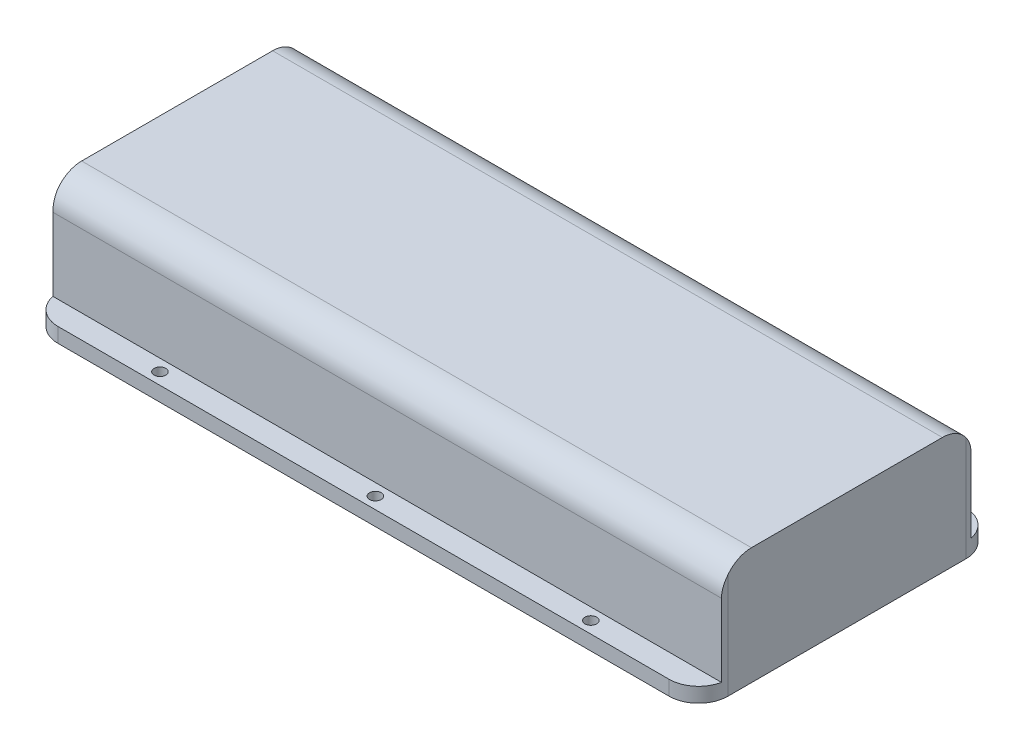
ISO-10303-21;
HEADER;
FILE_DESCRIPTION(('STEP AP214'),'2;1');
FILE_NAME('part.step','',(''),(''),'','','');
FILE_SCHEMA(('AUTOMOTIVE_DESIGN { 1 0 10303 214 1 1 1 1 }'));
ENDSEC;
DATA;
#1=APPLICATION_CONTEXT('core data for automotive mechanical design processes');
#2=APPLICATION_PROTOCOL_DEFINITION('international standard','automotive_design',2000,#1);
#3=PRODUCT_CONTEXT('',#1,'mechanical');
#4=PRODUCT('Part','Part','',(#3));
#5=PRODUCT_RELATED_PRODUCT_CATEGORY('part','',(#4));
#6=PRODUCT_DEFINITION_FORMATION('','',#4);
#7=PRODUCT_DEFINITION_CONTEXT('part definition',#1,'design');
#8=PRODUCT_DEFINITION('design','',#6,#7);
#9=PRODUCT_DEFINITION_SHAPE('','',#8);
#10=(LENGTH_UNIT() NAMED_UNIT(*) SI_UNIT(.MILLI.,.METRE.));
#11=(NAMED_UNIT(*) PLANE_ANGLE_UNIT() SI_UNIT($,.RADIAN.));
#12=(NAMED_UNIT(*) SI_UNIT($,.STERADIAN.) SOLID_ANGLE_UNIT());
#13=UNCERTAINTY_MEASURE_WITH_UNIT(LENGTH_MEASURE(1.E-05),#10,'distance_accuracy_value','');
#14=(GEOMETRIC_REPRESENTATION_CONTEXT(3) GLOBAL_UNCERTAINTY_ASSIGNED_CONTEXT((#13)) GLOBAL_UNIT_ASSIGNED_CONTEXT((#10,
#11,#12)) REPRESENTATION_CONTEXT('',''));
#15=CARTESIAN_POINT('',(0.,0.,0.));
#16=DIRECTION('',(0.,0.,1.));
#17=DIRECTION('',(1.,0.,0.));
#18=AXIS2_PLACEMENT_3D('',#15,#16,#17);
#19=CARTESIAN_POINT('',(0.,5.,0.));
#20=DIRECTION('',(1.,0.,0.));
#21=DIRECTION('',(0.,0.,-1.));
#22=AXIS2_PLACEMENT_3D('',#19,#20,#21);
#23=PLANE('',#22);
#24=DIRECTION('',(0.,0.,1.));
#25=VECTOR('',#24,1.);
#26=CARTESIAN_POINT('',(0.,39.8,-93.));
#27=LINE('',#26,#25);
#28=CARTESIAN_POINT('',(0.,39.8,-83.));
#29=VERTEX_POINT('',#28);
#30=CARTESIAN_POINT('',(0.,39.8,-18.));
#31=VERTEX_POINT('',#30);
#32=EDGE_CURVE('E197',#29,#31,#27,.T.);
#33=ORIENTED_EDGE('',*,*,#32,.F.);
#34=CARTESIAN_POINT('',(0.,29.8,-83.));
#35=DIRECTION('',(1.,0.,0.));
#36=DIRECTION('',(0.,0.,-1.));
#37=AXIS2_PLACEMENT_3D('',#34,#35,#36);
#38=CIRCLE('',#37,10.);
#39=CARTESIAN_POINT('',(0.,35.8000000000006,-91.));
#40=VERTEX_POINT('',#39);
#41=EDGE_CURVE('E323',#29,#40,#38,.F.);
#42=ORIENTED_EDGE('',*,*,#41,.T.);
#43=DIRECTION('',(0.,-1.,0.));
#44=VECTOR('',#43,1.);
#45=CARTESIAN_POINT('',(0.,5.,-91.));
#46=LINE('',#45,#44);
#47=CARTESIAN_POINT('',(0.,0.,-91.));
#48=VERTEX_POINT('',#47);
#49=EDGE_CURVE('E331',#40,#48,#46,.T.);
#50=ORIENTED_EDGE('',*,*,#49,.T.);
#51=DIRECTION('',(0.,0.,1.));
#52=VECTOR('',#51,1.);
#53=CARTESIAN_POINT('',(0.,0.,0.));
#54=LINE('',#53,#52);
#55=CARTESIAN_POINT('',(0.,0.,-10.));
#56=VERTEX_POINT('',#55);
#57=EDGE_CURVE('E637',#48,#56,#54,.T.);
#58=ORIENTED_EDGE('',*,*,#57,.T.);
#59=DIRECTION('',(0.,-1.,0.));
#60=VECTOR('',#59,1.);
#61=CARTESIAN_POINT('',(0.,5.,-10.));
#62=LINE('',#61,#60);
#63=CARTESIAN_POINT('',(0.,35.8000000000006,-10.));
#64=VERTEX_POINT('',#63);
#65=EDGE_CURVE('E287',#56,#64,#62,.F.);
#66=ORIENTED_EDGE('',*,*,#65,.T.);
#67=CARTESIAN_POINT('',(0.,29.8,-18.));
#68=DIRECTION('',(1.,0.,0.));
#69=DIRECTION('',(0.,0.,-1.));
#70=AXIS2_PLACEMENT_3D('',#67,#68,#69);
#71=CIRCLE('',#70,10.);
#72=EDGE_CURVE('E282',#64,#31,#71,.F.);
#73=ORIENTED_EDGE('',*,*,#72,.T.);
#74=EDGE_LOOP('',(#33,#42,#50,#58,#66,#73));
#75=FACE_BOUND('',#74,.T.);
#76=DIRECTION('',(0.,-1.,0.));
#77=VECTOR('',#76,1.);
#78=CARTESIAN_POINT('',(0.,25.4675334604514,-50.3378391953267));
#79=LINE('',#78,#77);
#80=CARTESIAN_POINT('',(0.,25.4675334604514,-50.3378391953267));
#81=VERTEX_POINT('',#80);
#82=CARTESIAN_POINT('',(0.,17.9000292423632,-50.3378391953267));
#83=VERTEX_POINT('',#82);
#84=EDGE_CURVE('E187',#81,#83,#79,.T.);
#85=ORIENTED_EDGE('',*,*,#84,.F.);
#86=DIRECTION('',(0.,0.,-1.));
#87=VECTOR('',#86,1.);
#88=CARTESIAN_POINT('',(0.,25.4675334604514,-50.3378391953267));
#89=LINE('',#88,#87);
#90=CARTESIAN_POINT('',(0.,25.4675334604514,-31.3109714469905));
#91=VERTEX_POINT('',#90);
#92=EDGE_CURVE('E184',#91,#81,#89,.T.);
#93=ORIENTED_EDGE('',*,*,#92,.F.);
#94=DIRECTION('',(0.,1.,0.));
#95=VECTOR('',#94,1.);
#96=CARTESIAN_POINT('',(0.,25.4675334604514,-31.3109714469905));
#97=LINE('',#96,#95);
#98=CARTESIAN_POINT('',(0.,17.9000292423632,-31.3109714469905));
#99=VERTEX_POINT('',#98);
#100=EDGE_CURVE('E348',#99,#91,#97,.T.);
#101=ORIENTED_EDGE('',*,*,#100,.F.);
#102=DIRECTION('',(0.,0.,1.));
#103=VECTOR('',#102,1.);
#104=CARTESIAN_POINT('',(0.,17.9000292423632,-50.3378391953267));
#105=LINE('',#104,#103);
#106=EDGE_CURVE('E346',#83,#99,#105,.T.);
#107=ORIENTED_EDGE('',*,*,#106,.F.);
#108=EDGE_LOOP('',(#85,#93,#101,#107));
#109=FACE_BOUND('',#108,.T.);
#110=ADVANCED_FACE('F32',(#75,#109),#23,.F.);
#111=CARTESIAN_POINT('',(0.,5.,0.));
#112=DIRECTION('',(0.,-1.,0.));
#113=DIRECTION('',(0.,0.,-1.));
#114=AXIS2_PLACEMENT_3D('',#111,#112,#113);
#115=PLANE('',#114);
#116=CARTESIAN_POINT('',(187.34,5.,-97.));
#117=DIRECTION('',(0.,1.,0.));
#118=DIRECTION('',(0.,0.,1.));
#119=AXIS2_PLACEMENT_3D('',#116,#117,#118);
#120=CIRCLE('',#119,2.);
#121=CARTESIAN_POINT('',(187.34,5.,-95.));
#122=VERTEX_POINT('',#121);
#123=EDGE_CURVE('E632',#122,#122,#120,.T.);
#124=ORIENTED_EDGE('',*,*,#123,.F.);
#125=EDGE_LOOP('',(#124));
#126=FACE_BOUND('',#125,.T.);
#127=CARTESIAN_POINT('',(114.,5.,-97.));
#128=DIRECTION('',(0.,1.,0.));
#129=DIRECTION('',(0.,0.,1.));
#130=AXIS2_PLACEMENT_3D('',#127,#128,#129);
#131=CIRCLE('',#130,2.);
#132=CARTESIAN_POINT('',(114.,5.,-95.));
#133=VERTEX_POINT('',#132);
#134=EDGE_CURVE('E621',#133,#133,#131,.T.);
#135=ORIENTED_EDGE('',*,*,#134,.F.);
#136=EDGE_LOOP('',(#135));
#137=FACE_BOUND('',#136,.T.);
#138=CARTESIAN_POINT('',(40.66,5.,-97.));
#139=DIRECTION('',(0.,1.,0.));
#140=DIRECTION('',(0.,0.,1.));
#141=AXIS2_PLACEMENT_3D('',#138,#139,#140);
#142=CIRCLE('',#141,2.);
#143=CARTESIAN_POINT('',(40.66,5.,-95.));
#144=VERTEX_POINT('',#143);
#145=EDGE_CURVE('E616',#144,#144,#142,.T.);
#146=ORIENTED_EDGE('',*,*,#145,.F.);
#147=EDGE_LOOP('',(#146));
#148=FACE_BOUND('',#147,.T.);
#149=DIRECTION('',(-1.,0.,0.));
#150=VECTOR('',#149,1.);
#151=CARTESIAN_POINT('',(0.,5.,-101.));
#152=LINE('',#151,#150);
#153=CARTESIAN_POINT('',(218.,5.,-101.));
#154=VERTEX_POINT('',#153);
#155=CARTESIAN_POINT('',(10.,5.,-101.));
#156=VERTEX_POINT('',#155);
#157=EDGE_CURVE('E326',#154,#156,#152,.T.);
#158=ORIENTED_EDGE('',*,*,#157,.T.);
#159=CARTESIAN_POINT('',(10.,5.,-91.));
#160=DIRECTION('',(0.,-1.,0.));
#161=DIRECTION('',(0.,0.,-1.));
#162=AXIS2_PLACEMENT_3D('',#159,#160,#161);
#163=CIRCLE('',#162,10.);
#164=CARTESIAN_POINT('',(0.202041028867284,5.,-93.));
#165=VERTEX_POINT('',#164);
#166=EDGE_CURVE('E232',#156,#165,#163,.F.);
#167=ORIENTED_EDGE('',*,*,#166,.T.);
#168=DIRECTION('',(-1.,0.,0.));
#169=VECTOR('',#168,1.);
#170=CARTESIAN_POINT('',(0.,5.,-93.));
#171=LINE('',#170,#169);
#172=CARTESIAN_POINT('',(227.797958971133,5.,-93.));
#173=VERTEX_POINT('',#172);
#174=EDGE_CURVE('E191',#173,#165,#171,.T.);
#175=ORIENTED_EDGE('',*,*,#174,.F.);
#176=CARTESIAN_POINT('',(218.,5.,-91.));
#177=DIRECTION('',(0.,-1.,0.));
#178=DIRECTION('',(0.,0.,-1.));
#179=AXIS2_PLACEMENT_3D('',#176,#177,#178);
#180=CIRCLE('',#179,10.);
#181=EDGE_CURVE('E230',#173,#154,#180,.F.);
#182=ORIENTED_EDGE('',*,*,#181,.T.);
#183=EDGE_LOOP('',(#158,#167,#175,#182));
#184=FACE_BOUND('',#183,.T.);
#185=ADVANCED_FACE('F366',(#126,#137,#148,#184),#115,.F.);
#186=CARTESIAN_POINT('',(187.34,5.,-4.));
#187=DIRECTION('',(0.,1.,0.));
#188=DIRECTION('',(0.,0.,1.));
#189=AXIS2_PLACEMENT_3D('',#186,#187,#188);
#190=CIRCLE('',#189,2.);
#191=CARTESIAN_POINT('',(187.34,5.,-2.00000000000001));
#192=VERTEX_POINT('',#191);
#193=EDGE_CURVE('E601',#192,#192,#190,.T.);
#194=ORIENTED_EDGE('',*,*,#193,.F.);
#195=EDGE_LOOP('',(#194));
#196=FACE_BOUND('',#195,.T.);
#197=CARTESIAN_POINT('',(114.,5.,-4.));
#198=DIRECTION('',(0.,1.,0.));
#199=DIRECTION('',(0.,0.,-1.));
#200=AXIS2_PLACEMENT_3D('',#197,#198,#199);
#201=CIRCLE('',#200,2.);
#202=CARTESIAN_POINT('',(114.,5.,-6.));
#203=VERTEX_POINT('',#202);
#204=EDGE_CURVE('E605',#203,#203,#201,.T.);
#205=ORIENTED_EDGE('',*,*,#204,.F.);
#206=EDGE_LOOP('',(#205));
#207=FACE_BOUND('',#206,.T.);
#208=CARTESIAN_POINT('',(40.66,5.,-4.));
#209=DIRECTION('',(0.,1.,0.));
#210=DIRECTION('',(0.,0.,-1.));
#211=AXIS2_PLACEMENT_3D('',#208,#209,#210);
#212=CIRCLE('',#211,1.99999999999997);
#213=CARTESIAN_POINT('',(40.66,5.,-5.99999999999997));
#214=VERTEX_POINT('',#213);
#215=EDGE_CURVE('E203',#214,#214,#212,.T.);
#216=ORIENTED_EDGE('',*,*,#215,.F.);
#217=EDGE_LOOP('',(#216));
#218=FACE_BOUND('',#217,.T.);
#219=DIRECTION('',(1.,0.,0.));
#220=VECTOR('',#219,1.);
#221=CARTESIAN_POINT('',(0.,5.,0.));
#222=LINE('',#221,#220);
#223=CARTESIAN_POINT('',(10.,5.,0.));
#224=VERTEX_POINT('',#223);
#225=CARTESIAN_POINT('',(218.,5.,0.));
#226=VERTEX_POINT('',#225);
#227=EDGE_CURVE('E294',#224,#226,#222,.T.);
#228=ORIENTED_EDGE('',*,*,#227,.T.);
#229=CARTESIAN_POINT('',(218.,5.,-10.));
#230=DIRECTION('',(0.,-1.,0.));
#231=DIRECTION('',(0.,0.,-1.));
#232=AXIS2_PLACEMENT_3D('',#229,#230,#231);
#233=CIRCLE('',#232,10.);
#234=CARTESIAN_POINT('',(227.797958971133,5.,-8.00000000000001));
#235=VERTEX_POINT('',#234);
#236=EDGE_CURVE('E11',#226,#235,#233,.F.);
#237=ORIENTED_EDGE('',*,*,#236,.T.);
#238=DIRECTION('',(1.,0.,0.));
#239=VECTOR('',#238,1.);
#240=CARTESIAN_POINT('',(0.,5.,-8.00000000000001));
#241=LINE('',#240,#239);
#242=CARTESIAN_POINT('',(0.202041028867289,5.,-8.00000000000001));
#243=VERTEX_POINT('',#242);
#244=EDGE_CURVE('E188',#243,#235,#241,.T.);
#245=ORIENTED_EDGE('',*,*,#244,.F.);
#246=CARTESIAN_POINT('',(10.,5.,-10.));
#247=DIRECTION('',(0.,-1.,0.));
#248=DIRECTION('',(0.,0.,-1.));
#249=AXIS2_PLACEMENT_3D('',#246,#247,#248);
#250=CIRCLE('',#249,10.);
#251=EDGE_CURVE('E45',#243,#224,#250,.F.);
#252=ORIENTED_EDGE('',*,*,#251,.T.);
#253=EDGE_LOOP('',(#228,#237,#245,#252));
#254=FACE_BOUND('',#253,.T.);
#255=ADVANCED_FACE('F292',(#196,#207,#218,#254),#115,.F.);
#256=CARTESIAN_POINT('',(0.,5.,0.));
#257=DIRECTION('',(0.,0.,-1.));
#258=DIRECTION('',(-1.,0.,0.));
#259=AXIS2_PLACEMENT_3D('',#256,#257,#258);
#260=PLANE('',#259);
#261=DIRECTION('',(1.,0.,0.));
#262=VECTOR('',#261,1.);
#263=CARTESIAN_POINT('',(0.,0.,0.));
#264=LINE('',#263,#262);
#265=CARTESIAN_POINT('',(10.,0.,0.));
#266=VERTEX_POINT('',#265);
#267=CARTESIAN_POINT('',(218.,0.,0.));
#268=VERTEX_POINT('',#267);
#269=EDGE_CURVE('E646',#266,#268,#264,.T.);
#270=ORIENTED_EDGE('',*,*,#269,.T.);
#271=DIRECTION('',(0.,-1.,0.));
#272=VECTOR('',#271,1.);
#273=CARTESIAN_POINT('',(218.,5.,0.));
#274=LINE('',#273,#272);
#275=EDGE_CURVE('E53',#268,#226,#274,.F.);
#276=ORIENTED_EDGE('',*,*,#275,.T.);
#277=ORIENTED_EDGE('',*,*,#227,.F.);
#278=DIRECTION('',(0.,-1.,0.));
#279=VECTOR('',#278,1.);
#280=CARTESIAN_POINT('',(10.,5.,0.));
#281=LINE('',#280,#279);
#282=EDGE_CURVE('E234',#224,#266,#281,.T.);
#283=ORIENTED_EDGE('',*,*,#282,.T.);
#284=EDGE_LOOP('',(#270,#276,#277,#283));
#285=FACE_BOUND('',#284,.T.);
#286=ADVANCED_FACE('F374',(#285),#260,.F.);
#287=CARTESIAN_POINT('',(228.,5.,0.));
#288=DIRECTION('',(-1.,0.,0.));
#289=DIRECTION('',(0.,0.,1.));
#290=AXIS2_PLACEMENT_3D('',#287,#288,#289);
#291=PLANE('',#290);
#292=DIRECTION('',(0.,-1.,0.));
#293=VECTOR('',#292,1.);
#294=CARTESIAN_POINT('',(228.,5.,-91.));
#295=LINE('',#294,#293);
#296=CARTESIAN_POINT('',(228.,0.,-91.));
#297=VERTEX_POINT('',#296);
#298=CARTESIAN_POINT('',(228.,35.8000000000006,-91.));
#299=VERTEX_POINT('',#298);
#300=EDGE_CURVE('E304',#297,#299,#295,.F.);
#301=ORIENTED_EDGE('',*,*,#300,.T.);
#302=CARTESIAN_POINT('',(228.,29.8,-83.));
#303=DIRECTION('',(-1.,0.,0.));
#304=DIRECTION('',(0.,0.,1.));
#305=AXIS2_PLACEMENT_3D('',#302,#303,#304);
#306=CIRCLE('',#305,10.);
#307=CARTESIAN_POINT('',(228.,39.8,-83.));
#308=VERTEX_POINT('',#307);
#309=EDGE_CURVE('E210',#299,#308,#306,.F.);
#310=ORIENTED_EDGE('',*,*,#309,.T.);
#311=DIRECTION('',(0.,0.,-1.));
#312=VECTOR('',#311,1.);
#313=CARTESIAN_POINT('',(228.,39.8,-93.));
#314=LINE('',#313,#312);
#315=CARTESIAN_POINT('',(228.,39.8,-18.));
#316=VERTEX_POINT('',#315);
#317=EDGE_CURVE('E200',#316,#308,#314,.T.);
#318=ORIENTED_EDGE('',*,*,#317,.F.);
#319=CARTESIAN_POINT('',(228.,29.8,-18.));
#320=DIRECTION('',(-1.,0.,0.));
#321=DIRECTION('',(0.,0.,1.));
#322=AXIS2_PLACEMENT_3D('',#319,#320,#321);
#323=CIRCLE('',#322,10.);
#324=CARTESIAN_POINT('',(228.,35.8000000000006,-10.));
#325=VERTEX_POINT('',#324);
#326=EDGE_CURVE('E301',#316,#325,#323,.F.);
#327=ORIENTED_EDGE('',*,*,#326,.T.);
#328=DIRECTION('',(0.,-1.,0.));
#329=VECTOR('',#328,1.);
#330=CARTESIAN_POINT('',(228.,5.,-10.));
#331=LINE('',#330,#329);
#332=CARTESIAN_POINT('',(228.,0.,-10.));
#333=VERTEX_POINT('',#332);
#334=EDGE_CURVE('E297',#325,#333,#331,.T.);
#335=ORIENTED_EDGE('',*,*,#334,.T.);
#336=DIRECTION('',(0.,0.,-1.));
#337=VECTOR('',#336,1.);
#338=CARTESIAN_POINT('',(228.,0.,0.));
#339=LINE('',#338,#337);
#340=EDGE_CURVE('E648',#333,#297,#339,.T.);
#341=ORIENTED_EDGE('',*,*,#340,.T.);
#342=EDGE_LOOP('',(#301,#310,#318,#327,#335,#341));
#343=FACE_BOUND('',#342,.T.);
#344=ADVANCED_FACE('F313',(#343),#291,.F.);
#345=CARTESIAN_POINT('',(0.,5.,-101.));
#346=DIRECTION('',(0.,0.,1.));
#347=DIRECTION('',(1.,0.,0.));
#348=AXIS2_PLACEMENT_3D('',#345,#346,#347);
#349=PLANE('',#348);
#350=DIRECTION('',(-1.,0.,0.));
#351=VECTOR('',#350,1.);
#352=CARTESIAN_POINT('',(0.,0.,-101.));
#353=LINE('',#352,#351);
#354=CARTESIAN_POINT('',(218.,0.,-101.));
#355=VERTEX_POINT('',#354);
#356=CARTESIAN_POINT('',(10.,0.,-101.));
#357=VERTEX_POINT('',#356);
#358=EDGE_CURVE('E641',#355,#357,#353,.T.);
#359=ORIENTED_EDGE('',*,*,#358,.T.);
#360=DIRECTION('',(0.,-1.,0.));
#361=VECTOR('',#360,1.);
#362=CARTESIAN_POINT('',(10.,5.,-101.));
#363=LINE('',#362,#361);
#364=EDGE_CURVE('E228',#357,#156,#363,.F.);
#365=ORIENTED_EDGE('',*,*,#364,.T.);
#366=ORIENTED_EDGE('',*,*,#157,.F.);
#367=DIRECTION('',(0.,-1.,0.));
#368=VECTOR('',#367,1.);
#369=CARTESIAN_POINT('',(218.,5.,-101.));
#370=LINE('',#369,#368);
#371=EDGE_CURVE('E226',#154,#355,#370,.T.);
#372=ORIENTED_EDGE('',*,*,#371,.T.);
#373=EDGE_LOOP('',(#359,#365,#366,#372));
#374=FACE_BOUND('',#373,.T.);
#375=ADVANCED_FACE('F379',(#374),#349,.F.);
#376=CARTESIAN_POINT('',(0.,0.,0.));
#377=DIRECTION('',(0.,-1.,0.));
#378=DIRECTION('',(0.,0.,-1.));
#379=AXIS2_PLACEMENT_3D('',#376,#377,#378);
#380=PLANE('',#379);
#381=CARTESIAN_POINT('',(40.66,0.,-4.));
#382=DIRECTION('',(0.,1.,0.));
#383=DIRECTION('',(0.,0.,-1.));
#384=AXIS2_PLACEMENT_3D('',#381,#382,#383);
#385=CIRCLE('',#384,1.99999999999997);
#386=CARTESIAN_POINT('',(40.66,0.,-5.99999999999997));
#387=VERTEX_POINT('',#386);
#388=EDGE_CURVE('E609',#387,#387,#385,.T.);
#389=ORIENTED_EDGE('',*,*,#388,.T.);
#390=EDGE_LOOP('',(#389));
#391=FACE_BOUND('',#390,.T.);
#392=CARTESIAN_POINT('',(114.,0.,-4.));
#393=DIRECTION('',(0.,1.,0.));
#394=DIRECTION('',(0.,0.,-1.));
#395=AXIS2_PLACEMENT_3D('',#392,#393,#394);
#396=CIRCLE('',#395,2.);
#397=CARTESIAN_POINT('',(114.,0.,-6.));
#398=VERTEX_POINT('',#397);
#399=EDGE_CURVE('E613',#398,#398,#396,.T.);
#400=ORIENTED_EDGE('',*,*,#399,.T.);
#401=EDGE_LOOP('',(#400));
#402=FACE_BOUND('',#401,.T.);
#403=CARTESIAN_POINT('',(40.66,0.,-97.));
#404=DIRECTION('',(0.,1.,0.));
#405=DIRECTION('',(0.,0.,1.));
#406=AXIS2_PLACEMENT_3D('',#403,#404,#405);
#407=CIRCLE('',#406,2.);
#408=CARTESIAN_POINT('',(40.66,0.,-95.));
#409=VERTEX_POINT('',#408);
#410=EDGE_CURVE('E618',#409,#409,#407,.T.);
#411=ORIENTED_EDGE('',*,*,#410,.T.);
#412=EDGE_LOOP('',(#411));
#413=FACE_BOUND('',#412,.T.);
#414=CARTESIAN_POINT('',(114.,0.,-97.));
#415=DIRECTION('',(0.,1.,0.));
#416=DIRECTION('',(0.,0.,1.));
#417=AXIS2_PLACEMENT_3D('',#414,#415,#416);
#418=CIRCLE('',#417,2.);
#419=CARTESIAN_POINT('',(114.,0.,-95.));
#420=VERTEX_POINT('',#419);
#421=EDGE_CURVE('E624',#420,#420,#418,.T.);
#422=ORIENTED_EDGE('',*,*,#421,.T.);
#423=EDGE_LOOP('',(#422));
#424=FACE_BOUND('',#423,.T.);
#425=CARTESIAN_POINT('',(187.34,0.,-4.));
#426=DIRECTION('',(0.,1.,0.));
#427=DIRECTION('',(0.,0.,1.));
#428=AXIS2_PLACEMENT_3D('',#425,#426,#427);
#429=CIRCLE('',#428,2.);
#430=CARTESIAN_POINT('',(187.34,0.,-2.00000000000001));
#431=VERTEX_POINT('',#430);
#432=EDGE_CURVE('E629',#431,#431,#429,.T.);
#433=ORIENTED_EDGE('',*,*,#432,.T.);
#434=EDGE_LOOP('',(#433));
#435=FACE_BOUND('',#434,.T.);
#436=CARTESIAN_POINT('',(187.34,0.,-97.));
#437=DIRECTION('',(0.,1.,0.));
#438=DIRECTION('',(0.,0.,1.));
#439=AXIS2_PLACEMENT_3D('',#436,#437,#438);
#440=CIRCLE('',#439,2.);
#441=CARTESIAN_POINT('',(187.34,0.,-95.));
#442=VERTEX_POINT('',#441);
#443=EDGE_CURVE('E634',#442,#442,#440,.T.);
#444=ORIENTED_EDGE('',*,*,#443,.T.);
#445=EDGE_LOOP('',(#444));
#446=FACE_BOUND('',#445,.T.);
#447=ORIENTED_EDGE('',*,*,#57,.F.);
#448=CARTESIAN_POINT('',(10.,0.,-91.));
#449=DIRECTION('',(0.,-1.,0.));
#450=DIRECTION('',(0.,0.,-1.));
#451=AXIS2_PLACEMENT_3D('',#448,#449,#450);
#452=CIRCLE('',#451,10.);
#453=EDGE_CURVE('E224',#48,#357,#452,.T.);
#454=ORIENTED_EDGE('',*,*,#453,.T.);
#455=ORIENTED_EDGE('',*,*,#358,.F.);
#456=CARTESIAN_POINT('',(218.,0.,-91.));
#457=DIRECTION('',(0.,-1.,0.));
#458=DIRECTION('',(0.,0.,-1.));
#459=AXIS2_PLACEMENT_3D('',#456,#457,#458);
#460=CIRCLE('',#459,10.);
#461=EDGE_CURVE('E222',#355,#297,#460,.T.);
#462=ORIENTED_EDGE('',*,*,#461,.T.);
#463=ORIENTED_EDGE('',*,*,#340,.F.);
#464=CARTESIAN_POINT('',(218.,0.,-10.));
#465=DIRECTION('',(0.,-1.,0.));
#466=DIRECTION('',(0.,0.,-1.));
#467=AXIS2_PLACEMENT_3D('',#464,#465,#466);
#468=CIRCLE('',#467,10.);
#469=EDGE_CURVE('E220',#333,#268,#468,.T.);
#470=ORIENTED_EDGE('',*,*,#469,.T.);
#471=ORIENTED_EDGE('',*,*,#269,.F.);
#472=CARTESIAN_POINT('',(10.,0.,-10.));
#473=DIRECTION('',(0.,-1.,0.));
#474=DIRECTION('',(0.,0.,-1.));
#475=AXIS2_PLACEMENT_3D('',#472,#473,#474);
#476=CIRCLE('',#475,10.);
#477=EDGE_CURVE('E218',#266,#56,#476,.T.);
#478=ORIENTED_EDGE('',*,*,#477,.T.);
#479=EDGE_LOOP('',(#447,#454,#455,#462,#463,#470,#471,#478));
#480=FACE_BOUND('',#479,.T.);
#481=ADVANCED_FACE('F382',(#391,#402,#413,#424,#435,#446,#480),#380,.T.);
#482=CARTESIAN_POINT('',(187.34,0.,-97.));
#483=DIRECTION('',(0.,1.,0.));
#484=DIRECTION('',(0.,0.,1.));
#485=AXIS2_PLACEMENT_3D('',#482,#483,#484);
#486=CYLINDRICAL_SURFACE('',#485,2.);
#487=ORIENTED_EDGE('',*,*,#443,.F.);
#488=EDGE_LOOP('',(#487));
#489=FACE_BOUND('',#488,.T.);
#490=ORIENTED_EDGE('',*,*,#123,.T.);
#491=EDGE_LOOP('',(#490));
#492=FACE_BOUND('',#491,.T.);
#493=ADVANCED_FACE('F385',(#489,#492),#486,.F.);
#494=CARTESIAN_POINT('',(187.34,0.,-4.));
#495=DIRECTION('',(0.,1.,0.));
#496=DIRECTION('',(0.,0.,1.));
#497=AXIS2_PLACEMENT_3D('',#494,#495,#496);
#498=CYLINDRICAL_SURFACE('',#497,2.);
#499=ORIENTED_EDGE('',*,*,#432,.F.);
#500=EDGE_LOOP('',(#499));
#501=FACE_BOUND('',#500,.T.);
#502=ORIENTED_EDGE('',*,*,#193,.T.);
#503=EDGE_LOOP('',(#502));
#504=FACE_BOUND('',#503,.T.);
#505=ADVANCED_FACE('F390',(#501,#504),#498,.F.);
#506=CARTESIAN_POINT('',(114.,0.,-97.));
#507=DIRECTION('',(0.,1.,0.));
#508=DIRECTION('',(0.,0.,1.));
#509=AXIS2_PLACEMENT_3D('',#506,#507,#508);
#510=CYLINDRICAL_SURFACE('',#509,2.);
#511=ORIENTED_EDGE('',*,*,#421,.F.);
#512=EDGE_LOOP('',(#511));
#513=FACE_BOUND('',#512,.T.);
#514=ORIENTED_EDGE('',*,*,#134,.T.);
#515=EDGE_LOOP('',(#514));
#516=FACE_BOUND('',#515,.T.);
#517=ADVANCED_FACE('F394',(#513,#516),#510,.F.);
#518=CARTESIAN_POINT('',(40.66,0.,-97.));
#519=DIRECTION('',(0.,1.,0.));
#520=DIRECTION('',(0.,0.,1.));
#521=AXIS2_PLACEMENT_3D('',#518,#519,#520);
#522=CYLINDRICAL_SURFACE('',#521,2.);
#523=ORIENTED_EDGE('',*,*,#410,.F.);
#524=EDGE_LOOP('',(#523));
#525=FACE_BOUND('',#524,.T.);
#526=ORIENTED_EDGE('',*,*,#145,.T.);
#527=EDGE_LOOP('',(#526));
#528=FACE_BOUND('',#527,.T.);
#529=ADVANCED_FACE('F398',(#525,#528),#522,.F.);
#530=CARTESIAN_POINT('',(114.,0.,-4.));
#531=DIRECTION('',(0.,1.,0.));
#532=DIRECTION('',(0.,0.,1.));
#533=AXIS2_PLACEMENT_3D('',#530,#531,#532);
#534=CYLINDRICAL_SURFACE('',#533,2.);
#535=ORIENTED_EDGE('',*,*,#399,.F.);
#536=EDGE_LOOP('',(#535));
#537=FACE_BOUND('',#536,.T.);
#538=ORIENTED_EDGE('',*,*,#204,.T.);
#539=EDGE_LOOP('',(#538));
#540=FACE_BOUND('',#539,.T.);
#541=ADVANCED_FACE('F402',(#537,#540),#534,.F.);
#542=CARTESIAN_POINT('',(40.66,0.,-4.));
#543=DIRECTION('',(0.,1.,0.));
#544=DIRECTION('',(0.,0.,1.));
#545=AXIS2_PLACEMENT_3D('',#542,#543,#544);
#546=CYLINDRICAL_SURFACE('',#545,1.99999999999997);
#547=ORIENTED_EDGE('',*,*,#388,.F.);
#548=EDGE_LOOP('',(#547));
#549=FACE_BOUND('',#548,.T.);
#550=ORIENTED_EDGE('',*,*,#215,.T.);
#551=EDGE_LOOP('',(#550));
#552=FACE_BOUND('',#551,.T.);
#553=ADVANCED_FACE('F406',(#549,#552),#546,.F.);
#554=CARTESIAN_POINT('',(0.,39.8,-8.00000000000001));
#555=DIRECTION('',(0.,0.,-1.));
#556=DIRECTION('',(-1.,0.,0.));
#557=AXIS2_PLACEMENT_3D('',#554,#555,#556);
#558=PLANE('',#557);
#559=ORIENTED_EDGE('',*,*,#244,.T.);
#560=DIRECTION('',(0.,-1.,0.));
#561=VECTOR('',#560,1.);
#562=CARTESIAN_POINT('',(227.797958971133,5.,-8.00000000000001));
#563=LINE('',#562,#561);
#564=CARTESIAN_POINT('',(227.797958971133,29.8,-8.00000000000001));
#565=VERTEX_POINT('',#564);
#566=EDGE_CURVE('E216',#235,#565,#563,.F.);
#567=ORIENTED_EDGE('',*,*,#566,.T.);
#568=DIRECTION('',(1.,0.,0.));
#569=VECTOR('',#568,1.);
#570=CARTESIAN_POINT('',(0.,29.8,-8.00000000000001));
#571=LINE('',#570,#569);
#572=CARTESIAN_POINT('',(0.202041028867285,29.8,-8.00000000000001));
#573=VERTEX_POINT('',#572);
#574=EDGE_CURVE('E214',#565,#573,#571,.F.);
#575=ORIENTED_EDGE('',*,*,#574,.T.);
#576=DIRECTION('',(0.,-1.,0.));
#577=VECTOR('',#576,1.);
#578=CARTESIAN_POINT('',(0.202041028867285,39.8,-8.00000000000001));
#579=LINE('',#578,#577);
#580=EDGE_CURVE('E212',#573,#243,#579,.T.);
#581=ORIENTED_EDGE('',*,*,#580,.T.);
#582=EDGE_LOOP('',(#559,#567,#575,#581));
#583=FACE_BOUND('',#582,.T.);
#584=ADVANCED_FACE('F290',(#583),#558,.F.);
#585=CARTESIAN_POINT('',(0.,39.8,-93.));
#586=DIRECTION('',(0.,0.,1.));
#587=DIRECTION('',(1.,0.,0.));
#588=AXIS2_PLACEMENT_3D('',#585,#586,#587);
#589=PLANE('',#588);
#590=ORIENTED_EDGE('',*,*,#174,.T.);
#591=DIRECTION('',(0.,-1.,0.));
#592=VECTOR('',#591,1.);
#593=CARTESIAN_POINT('',(0.202041028867284,5.,-93.));
#594=LINE('',#593,#592);
#595=CARTESIAN_POINT('',(0.202041028867284,29.8,-93.));
#596=VERTEX_POINT('',#595);
#597=EDGE_CURVE('E302',#165,#596,#594,.F.);
#598=ORIENTED_EDGE('',*,*,#597,.T.);
#599=DIRECTION('',(-1.,0.,0.));
#600=VECTOR('',#599,1.);
#601=CARTESIAN_POINT('',(228.,29.8,-93.));
#602=LINE('',#601,#600);
#603=CARTESIAN_POINT('',(227.797958971133,29.8,-93.));
#604=VERTEX_POINT('',#603);
#605=EDGE_CURVE('E306',#596,#604,#602,.F.);
#606=ORIENTED_EDGE('',*,*,#605,.T.);
#607=DIRECTION('',(0.,-1.,0.));
#608=VECTOR('',#607,1.);
#609=CARTESIAN_POINT('',(227.797958971133,39.8,-93.));
#610=LINE('',#609,#608);
#611=EDGE_CURVE('E334',#604,#173,#610,.T.);
#612=ORIENTED_EDGE('',*,*,#611,.T.);
#613=EDGE_LOOP('',(#590,#598,#606,#612));
#614=FACE_BOUND('',#613,.T.);
#615=ADVANCED_FACE('F340',(#614),#589,.F.);
#616=CARTESIAN_POINT('',(0.,39.8,0.));
#617=DIRECTION('',(0.,1.,0.));
#618=DIRECTION('',(0.,0.,1.));
#619=AXIS2_PLACEMENT_3D('',#616,#617,#618);
#620=PLANE('',#619);
#621=ORIENTED_EDGE('',*,*,#317,.T.);
#622=DIRECTION('',(-1.,0.,0.));
#623=VECTOR('',#622,1.);
#624=CARTESIAN_POINT('',(0.,39.8,-83.));
#625=LINE('',#624,#623);
#626=EDGE_CURVE('E320',#308,#29,#625,.T.);
#627=ORIENTED_EDGE('',*,*,#626,.T.);
#628=ORIENTED_EDGE('',*,*,#32,.T.);
#629=DIRECTION('',(1.,0.,0.));
#630=VECTOR('',#629,1.);
#631=CARTESIAN_POINT('',(228.,39.8,-18.));
#632=LINE('',#631,#630);
#633=EDGE_CURVE('E322',#31,#316,#632,.T.);
#634=ORIENTED_EDGE('',*,*,#633,.T.);
#635=EDGE_LOOP('',(#621,#627,#628,#634));
#636=FACE_BOUND('',#635,.T.);
#637=ADVANCED_FACE('F319',(#636),#620,.T.);
#638=CARTESIAN_POINT('',(-2.2,25.4675334604514,-50.3378391953267));
#639=DIRECTION('',(0.,0.,1.));
#640=DIRECTION('',(1.,0.,0.));
#641=AXIS2_PLACEMENT_3D('',#638,#639,#640);
#642=PLANE('',#641);
#643=ORIENTED_EDGE('',*,*,#84,.T.);
#644=DIRECTION('',(1.,0.,0.));
#645=VECTOR('',#644,1.);
#646=CARTESIAN_POINT('',(-2.2,17.9000292423632,-50.3378391953267));
#647=LINE('',#646,#645);
#648=CARTESIAN_POINT('',(-2.2,17.9000292423632,-50.3378391953267));
#649=VERTEX_POINT('',#648);
#650=EDGE_CURVE('E168',#649,#83,#647,.T.);
#651=ORIENTED_EDGE('',*,*,#650,.F.);
#652=DIRECTION('',(0.,-1.,0.));
#653=VECTOR('',#652,1.);
#654=CARTESIAN_POINT('',(-2.2,25.4675334604514,-50.3378391953267));
#655=LINE('',#654,#653);
#656=CARTESIAN_POINT('',(-2.2,25.4675334604514,-50.3378391953267));
#657=VERTEX_POINT('',#656);
#658=EDGE_CURVE('E175',#657,#649,#655,.T.);
#659=ORIENTED_EDGE('',*,*,#658,.F.);
#660=DIRECTION('',(1.,0.,0.));
#661=VECTOR('',#660,1.);
#662=CARTESIAN_POINT('',(-2.2,25.4675334604514,-50.3378391953267));
#663=LINE('',#662,#661);
#664=EDGE_CURVE('E357',#657,#81,#663,.T.);
#665=ORIENTED_EDGE('',*,*,#664,.T.);
#666=EDGE_LOOP('',(#643,#651,#659,#665));
#667=FACE_BOUND('',#666,.T.);
#668=ADVANCED_FACE('F186',(#667),#642,.F.);
#669=CARTESIAN_POINT('',(-2.2,17.9000292423632,-50.3378391953267));
#670=DIRECTION('',(0.,1.,0.));
#671=DIRECTION('',(0.,0.,1.));
#672=AXIS2_PLACEMENT_3D('',#669,#670,#671);
#673=PLANE('',#672);
#674=ORIENTED_EDGE('',*,*,#106,.T.);
#675=DIRECTION('',(1.,0.,0.));
#676=VECTOR('',#675,1.);
#677=CARTESIAN_POINT('',(-2.2,17.9000292423632,-31.3109714469905));
#678=LINE('',#677,#676);
#679=CARTESIAN_POINT('',(-2.2,17.9000292423632,-31.3109714469905));
#680=VERTEX_POINT('',#679);
#681=EDGE_CURVE('E171',#680,#99,#678,.T.);
#682=ORIENTED_EDGE('',*,*,#681,.F.);
#683=DIRECTION('',(0.,0.,1.));
#684=VECTOR('',#683,1.);
#685=CARTESIAN_POINT('',(-2.2,17.9000292423632,-50.3378391953267));
#686=LINE('',#685,#684);
#687=EDGE_CURVE('E163',#649,#680,#686,.T.);
#688=ORIENTED_EDGE('',*,*,#687,.F.);
#689=ORIENTED_EDGE('',*,*,#650,.T.);
#690=EDGE_LOOP('',(#674,#682,#688,#689));
#691=FACE_BOUND('',#690,.T.);
#692=ADVANCED_FACE('F166',(#691),#673,.F.);
#693=CARTESIAN_POINT('',(-2.2,25.4675334604514,-31.3109714469905));
#694=DIRECTION('',(0.,0.,-1.));
#695=DIRECTION('',(-1.,0.,0.));
#696=AXIS2_PLACEMENT_3D('',#693,#694,#695);
#697=PLANE('',#696);
#698=ORIENTED_EDGE('',*,*,#100,.T.);
#699=DIRECTION('',(1.,0.,0.));
#700=VECTOR('',#699,1.);
#701=CARTESIAN_POINT('',(-2.2,25.4675334604514,-31.3109714469905));
#702=LINE('',#701,#700);
#703=CARTESIAN_POINT('',(-2.2,25.4675334604514,-31.3109714469905));
#704=VERTEX_POINT('',#703);
#705=EDGE_CURVE('E193',#704,#91,#702,.T.);
#706=ORIENTED_EDGE('',*,*,#705,.F.);
#707=DIRECTION('',(0.,1.,0.));
#708=VECTOR('',#707,1.);
#709=CARTESIAN_POINT('',(-2.2,25.4675334604514,-31.3109714469905));
#710=LINE('',#709,#708);
#711=EDGE_CURVE('E174',#680,#704,#710,.T.);
#712=ORIENTED_EDGE('',*,*,#711,.F.);
#713=ORIENTED_EDGE('',*,*,#681,.T.);
#714=EDGE_LOOP('',(#698,#706,#712,#713));
#715=FACE_BOUND('',#714,.T.);
#716=ADVANCED_FACE('F363',(#715),#697,.F.);
#717=CARTESIAN_POINT('',(-2.2,25.4675334604514,-50.3378391953267));
#718=DIRECTION('',(0.,-1.,0.));
#719=DIRECTION('',(0.,0.,-1.));
#720=AXIS2_PLACEMENT_3D('',#717,#718,#719);
#721=PLANE('',#720);
#722=ORIENTED_EDGE('',*,*,#92,.T.);
#723=ORIENTED_EDGE('',*,*,#664,.F.);
#724=DIRECTION('',(0.,0.,-1.));
#725=VECTOR('',#724,1.);
#726=CARTESIAN_POINT('',(-2.2,25.4675334604514,-50.3378391953267));
#727=LINE('',#726,#725);
#728=EDGE_CURVE('E180',#704,#657,#727,.T.);
#729=ORIENTED_EDGE('',*,*,#728,.F.);
#730=ORIENTED_EDGE('',*,*,#705,.T.);
#731=EDGE_LOOP('',(#722,#723,#729,#730));
#732=FACE_BOUND('',#731,.T.);
#733=ADVANCED_FACE('F361',(#732),#721,.F.);
#734=CARTESIAN_POINT('',(-2.2,0.,0.));
#735=DIRECTION('',(-1.,0.,0.));
#736=DIRECTION('',(0.,0.,1.));
#737=AXIS2_PLACEMENT_3D('',#734,#735,#736);
#738=PLANE('',#737);
#739=ORIENTED_EDGE('',*,*,#658,.T.);
#740=ORIENTED_EDGE('',*,*,#687,.T.);
#741=ORIENTED_EDGE('',*,*,#711,.T.);
#742=ORIENTED_EDGE('',*,*,#728,.T.);
#743=EDGE_LOOP('',(#739,#740,#741,#742));
#744=FACE_BOUND('',#743,.T.);
#745=ADVANCED_FACE('F178',(#744),#738,.T.);
#746=CARTESIAN_POINT('',(218.,5.,-91.));
#747=DIRECTION('',(0.,-1.,0.));
#748=DIRECTION('',(0.,0.,-1.));
#749=AXIS2_PLACEMENT_3D('',#746,#747,#748);
#750=CYLINDRICAL_SURFACE('',#749,10.);
#751=ORIENTED_EDGE('',*,*,#181,.F.);
#752=ORIENTED_EDGE('',*,*,#611,.F.);
#753=CARTESIAN_POINT('',(228.,35.8000000000004,-90.9999999999997));
#754=CARTESIAN_POINT('',(227.99996372851,35.5727958881253,-91.170443915486));
#755=CARTESIAN_POINT('',(227.995640936858,35.3383494773397,-91.331113894738));
#756=CARTESIAN_POINT('',(227.981163918996,34.8568577297199,-91.6318335016923));
#757=CARTESIAN_POINT('',(227.971011723978,34.6098168086133,-91.7718902904936));
#758=CARTESIAN_POINT('',(227.947934929813,34.1117942145827,-92.0268812900301));
#759=CARTESIAN_POINT('',(227.935094118892,33.8611070506605,-92.1423997710043));
#760=CARTESIAN_POINT('',(227.908704741315,33.3510668704769,-92.3523240223743));
#761=CARTESIAN_POINT('',(227.895156147146,33.091713517505,-92.4467289713399));
#762=CARTESIAN_POINT('',(227.869289762329,32.5661103414352,-92.6137739103388));
#763=CARTESIAN_POINT('',(227.856971604964,32.2998626030992,-92.6864203982104));
#764=CARTESIAN_POINT('',(227.835125148527,31.7621811873557,-92.8094808431212));
#765=CARTESIAN_POINT('',(227.825596760776,31.4907476750818,-92.8598955068742));
#766=CARTESIAN_POINT('',(227.810256128664,30.9368052929267,-92.939220694208));
#767=CARTESIAN_POINT('',(227.804555889147,30.6541995886842,-92.9674868143629));
#768=CARTESIAN_POINT('',(227.799633118195,30.2292521549266,-92.9917920209962));
#769=CARTESIAN_POINT('',(227.798596991516,30.0873935320182,-92.9968770809123));
#770=CARTESIAN_POINT('',(227.797752922523,29.8035835805477,-93.0010061150631));
#771=CARTESIAN_POINT('',(227.797944990418,29.6616322512247,-93.0000500390807));
#772=CARTESIAN_POINT('',(227.798759901002,29.5197506529464,-92.9960722438104));
#773=B_SPLINE_CURVE_WITH_KNOTS('',3,(#753,#754,#755,#756,#757,#758,#759,#760,#761,#762,#763,
#764,#765,#766,#767,#768,#769,#770,#771,#772),.UNSPECIFIED.,.F.,.F.,(4,2,2,2,2,2,2,2,2,4),(0.,
0.851701981078672,1.7031073757445,2.53113248021196,3.35918979371677,4.18699957318905,
5.0147830360317,5.86583840965541,6.29158343474251,6.71733199884127),.UNSPECIFIED.);
#774=EDGE_CURVE('E246',#299,#604,#773,.T.);
#775=ORIENTED_EDGE('',*,*,#774,.F.);
#776=ORIENTED_EDGE('',*,*,#300,.F.);
#777=ORIENTED_EDGE('',*,*,#461,.F.);
#778=ORIENTED_EDGE('',*,*,#371,.F.);
#779=EDGE_LOOP('',(#751,#752,#775,#776,#777,#778));
#780=FACE_BOUND('',#779,.T.);
#781=ADVANCED_FACE('F258',(#780),#750,.T.);
#782=CARTESIAN_POINT('',(10.,5.,-91.));
#783=DIRECTION('',(0.,-1.,0.));
#784=DIRECTION('',(0.,0.,-1.));
#785=AXIS2_PLACEMENT_3D('',#782,#783,#784);
#786=CYLINDRICAL_SURFACE('',#785,10.);
#787=ORIENTED_EDGE('',*,*,#453,.F.);
#788=ORIENTED_EDGE('',*,*,#49,.F.);
#789=CARTESIAN_POINT('',(0.,35.8000000000004,-90.9999999999997));
#790=CARTESIAN_POINT('',(3.6271490054272E-05,35.5727958881253,-91.170443915486));
#791=CARTESIAN_POINT('',(0.00435906314151843,35.3383494773397,-91.331113894738));
#792=CARTESIAN_POINT('',(0.0188360810039251,34.8568577297199,-91.6318335016923));
#793=CARTESIAN_POINT('',(0.0289882760223229,34.6098168086133,-91.7718902904936));
#794=CARTESIAN_POINT('',(0.0520650701874297,34.1117942145827,-92.0268812900301));
#795=CARTESIAN_POINT('',(0.06490588110766,33.8611070506605,-92.1423997710043));
#796=CARTESIAN_POINT('',(0.0912952586853004,33.3510668704769,-92.3523240223743));
#797=CARTESIAN_POINT('',(0.104843852854005,33.091713517505,-92.4467289713399));
#798=CARTESIAN_POINT('',(0.130710237670593,32.5661103414352,-92.6137739103388));
#799=CARTESIAN_POINT('',(0.143028395036105,32.2998626030992,-92.6864203982104));
#800=CARTESIAN_POINT('',(0.164874851473341,31.7621811873556,-92.8094808431212));
#801=CARTESIAN_POINT('',(0.174403239224089,31.4907476750817,-92.8598955068742));
#802=CARTESIAN_POINT('',(0.189743871335561,30.9368052929266,-92.939220694208));
#803=CARTESIAN_POINT('',(0.195444110853139,30.6541995886842,-92.9674868143629));
#804=CARTESIAN_POINT('',(0.200366881805021,30.2292521549266,-92.9917920209962));
#805=CARTESIAN_POINT('',(0.201403008483775,30.0873935320182,-92.9968770809123));
#806=CARTESIAN_POINT('',(0.202247077476742,29.8035835805477,-93.0010061150631));
#807=CARTESIAN_POINT('',(0.202055009581584,29.6616322512247,-93.0000500390807));
#808=CARTESIAN_POINT('',(0.201240098997738,29.5197506529464,-92.9960722438104));
#809=B_SPLINE_CURVE_WITH_KNOTS('',3,(#789,#790,#791,#792,#793,#794,#795,#796,#797,#798,#799,
#800,#801,#802,#803,#804,#805,#806,#807,#808),.UNSPECIFIED.,.F.,.F.,(4,2,2,2,2,2,2,2,2,4),(0.,
0.851701981078672,1.7031073757445,2.53113248021196,3.35918979371677,4.18699957318905,
5.01478303603171,5.86583840965542,6.29158343474251,6.71733199884127),.UNSPECIFIED.);
#810=EDGE_CURVE('E238',#596,#40,#809,.F.);
#811=ORIENTED_EDGE('',*,*,#810,.F.);
#812=ORIENTED_EDGE('',*,*,#597,.F.);
#813=ORIENTED_EDGE('',*,*,#166,.F.);
#814=ORIENTED_EDGE('',*,*,#364,.F.);
#815=EDGE_LOOP('',(#787,#788,#811,#812,#813,#814));
#816=FACE_BOUND('',#815,.T.);
#817=ADVANCED_FACE('F251',(#816),#786,.T.);
#818=CARTESIAN_POINT('',(0.,29.8,-83.));
#819=DIRECTION('',(1.,0.,0.));
#820=DIRECTION('',(0.,0.,-1.));
#821=AXIS2_PLACEMENT_3D('',#818,#819,#820);
#822=CYLINDRICAL_SURFACE('',#821,10.);
#823=ORIENTED_EDGE('',*,*,#774,.T.);
#824=ORIENTED_EDGE('',*,*,#605,.F.);
#825=ORIENTED_EDGE('',*,*,#810,.T.);
#826=ORIENTED_EDGE('',*,*,#41,.F.);
#827=ORIENTED_EDGE('',*,*,#626,.F.);
#828=ORIENTED_EDGE('',*,*,#309,.F.);
#829=EDGE_LOOP('',(#823,#824,#825,#826,#827,#828));
#830=FACE_BOUND('',#829,.T.);
#831=ADVANCED_FACE('F254',(#830),#822,.T.);
#832=CARTESIAN_POINT('',(10.,5.,-10.));
#833=DIRECTION('',(0.,-1.,0.));
#834=DIRECTION('',(0.,0.,-1.));
#835=AXIS2_PLACEMENT_3D('',#832,#833,#834);
#836=CYLINDRICAL_SURFACE('',#835,10.);
#837=ORIENTED_EDGE('',*,*,#251,.F.);
#838=ORIENTED_EDGE('',*,*,#580,.F.);
#839=CARTESIAN_POINT('',(0.,35.8000000000004,-10.0000000000003));
#840=CARTESIAN_POINT('',(3.62714900566158E-05,35.5727958881253,-9.82955608451399));
#841=CARTESIAN_POINT('',(0.00435906314152032,35.3383494773397,-9.66888610526204));
#842=CARTESIAN_POINT('',(0.018836081003925,34.8568577297199,-9.3681664983077));
#843=CARTESIAN_POINT('',(0.0289882760223214,34.6098168086133,-9.22810970950638));
#844=CARTESIAN_POINT('',(0.0520650701874282,34.1117942145827,-8.97311870996996));
#845=CARTESIAN_POINT('',(0.0649058811076598,33.8611070506605,-8.85760022899569));
#846=CARTESIAN_POINT('',(0.0912952586853006,33.3510668704769,-8.64767597762568));
#847=CARTESIAN_POINT('',(0.104843852854005,33.091713517505,-8.55327102866013));
#848=CARTESIAN_POINT('',(0.130710237670593,32.5661103414352,-8.38622608966121));
#849=CARTESIAN_POINT('',(0.143028395036105,32.2998626030992,-8.31357960178965));
#850=CARTESIAN_POINT('',(0.164874851473342,31.7621811873556,-8.1905191568788));
#851=CARTESIAN_POINT('',(0.174403239224088,31.4907476750817,-8.14010449312582));
#852=CARTESIAN_POINT('',(0.18974387133556,30.9368052929266,-8.06077930579203));
#853=CARTESIAN_POINT('',(0.195444110853138,30.6541995886842,-8.03251318563715));
#854=CARTESIAN_POINT('',(0.200366881805021,30.2292521549266,-8.00820797900386));
#855=CARTESIAN_POINT('',(0.201403008483776,30.0873935320182,-8.00312291908767));
#856=CARTESIAN_POINT('',(0.202247077476744,29.8035835805476,-7.99899388493692));
#857=CARTESIAN_POINT('',(0.202055009581585,29.6616322512247,-7.9999499609193));
#858=CARTESIAN_POINT('',(0.201240098997737,29.5197506529464,-8.00392775618964));
#859=B_SPLINE_CURVE_WITH_KNOTS('',3,(#839,#840,#841,#842,#843,#844,#845,#846,#847,#848,#849,
#850,#851,#852,#853,#854,#855,#856,#857,#858),.UNSPECIFIED.,.F.,.F.,(4,2,2,2,2,2,2,2,2,4),(0.,
0.851701981078662,1.7031073757445,2.53113248021196,3.35918979371678,4.18699957318906,
5.01478303603171,5.86583840965543,6.29158343474252,6.71733199884128),.UNSPECIFIED.);
#860=EDGE_CURVE('E37',#64,#573,#859,.T.);
#861=ORIENTED_EDGE('',*,*,#860,.F.);
#862=ORIENTED_EDGE('',*,*,#65,.F.);
#863=ORIENTED_EDGE('',*,*,#477,.F.);
#864=ORIENTED_EDGE('',*,*,#282,.F.);
#865=EDGE_LOOP('',(#837,#838,#861,#862,#863,#864));
#866=FACE_BOUND('',#865,.T.);
#867=ADVANCED_FACE('F34',(#866),#836,.T.);
#868=CARTESIAN_POINT('',(218.,5.,-10.));
#869=DIRECTION('',(0.,-1.,0.));
#870=DIRECTION('',(0.,0.,-1.));
#871=AXIS2_PLACEMENT_3D('',#868,#869,#870);
#872=CYLINDRICAL_SURFACE('',#871,10.);
#873=ORIENTED_EDGE('',*,*,#469,.F.);
#874=ORIENTED_EDGE('',*,*,#334,.F.);
#875=CARTESIAN_POINT('',(228.,35.8000000000004,-10.0000000000003));
#876=CARTESIAN_POINT('',(227.99996372851,35.5727958881253,-9.82955608451399));
#877=CARTESIAN_POINT('',(227.995640936858,35.3383494773397,-9.66888610526204));
#878=CARTESIAN_POINT('',(227.981163918996,34.8568577297199,-9.3681664983077));
#879=CARTESIAN_POINT('',(227.971011723978,34.6098168086133,-9.22810970950638));
#880=CARTESIAN_POINT('',(227.947934929813,34.1117942145827,-8.97311870996996));
#881=CARTESIAN_POINT('',(227.935094118892,33.8611070506605,-8.85760022899569));
#882=CARTESIAN_POINT('',(227.908704741315,33.3510668704769,-8.64767597762568));
#883=CARTESIAN_POINT('',(227.895156147146,33.091713517505,-8.55327102866013));
#884=CARTESIAN_POINT('',(227.869289762329,32.5661103414352,-8.38622608966122));
#885=CARTESIAN_POINT('',(227.856971604964,32.2998626030992,-8.31357960178966));
#886=CARTESIAN_POINT('',(227.835125148527,31.7621811873556,-8.1905191568788));
#887=CARTESIAN_POINT('',(227.825596760776,31.4907476750817,-8.14010449312582));
#888=CARTESIAN_POINT('',(227.810256128664,30.9368052929266,-8.06077930579203));
#889=CARTESIAN_POINT('',(227.804555889147,30.6541995886842,-8.03251318563715));
#890=CARTESIAN_POINT('',(227.799633118195,30.2292521549266,-8.00820797900386));
#891=CARTESIAN_POINT('',(227.798596991516,30.0873935320182,-8.00312291908767));
#892=CARTESIAN_POINT('',(227.797752922523,29.8035835805477,-7.99899388493692));
#893=CARTESIAN_POINT('',(227.797944990418,29.6616322512247,-7.9999499609193));
#894=CARTESIAN_POINT('',(227.798759901002,29.5197506529464,-8.00392775618964));
#895=B_SPLINE_CURVE_WITH_KNOTS('',3,(#875,#876,#877,#878,#879,#880,#881,#882,#883,#884,#885,
#886,#887,#888,#889,#890,#891,#892,#893,#894),.UNSPECIFIED.,.F.,.F.,(4,2,2,2,2,2,2,2,2,4),(0.,
0.851701981078668,1.7031073757445,2.53113248021196,3.35918979371677,4.18699957318905,
5.0147830360317,5.86583840965542,6.29158343474252,6.71733199884127),.UNSPECIFIED.);
#896=EDGE_CURVE('E270',#565,#325,#895,.F.);
#897=ORIENTED_EDGE('',*,*,#896,.F.);
#898=ORIENTED_EDGE('',*,*,#566,.F.);
#899=ORIENTED_EDGE('',*,*,#236,.F.);
#900=ORIENTED_EDGE('',*,*,#275,.F.);
#901=EDGE_LOOP('',(#873,#874,#897,#898,#899,#900));
#902=FACE_BOUND('',#901,.T.);
#903=ADVANCED_FACE('F264',(#902),#872,.T.);
#904=CARTESIAN_POINT('',(0.,29.8,-18.));
#905=DIRECTION('',(-1.,0.,0.));
#906=DIRECTION('',(0.,0.,1.));
#907=AXIS2_PLACEMENT_3D('',#904,#905,#906);
#908=CYLINDRICAL_SURFACE('',#907,10.);
#909=ORIENTED_EDGE('',*,*,#860,.T.);
#910=ORIENTED_EDGE('',*,*,#574,.F.);
#911=ORIENTED_EDGE('',*,*,#896,.T.);
#912=ORIENTED_EDGE('',*,*,#326,.F.);
#913=ORIENTED_EDGE('',*,*,#633,.F.);
#914=ORIENTED_EDGE('',*,*,#72,.F.);
#915=EDGE_LOOP('',(#909,#910,#911,#912,#913,#914));
#916=FACE_BOUND('',#915,.T.);
#917=ADVANCED_FACE('F267',(#916),#908,.T.);
#918=CLOSED_SHELL('',(#110,#185,#255,#286,#344,#375,#481,#493,#505,#517,#529,#541,#553,#584,
#615,#637,#668,#692,#716,#733,#745,#781,#817,#831,#867,#903,#917));
#919=MANIFOLD_SOLID_BREP('B2',#918);
#920=ADVANCED_BREP_SHAPE_REPRESENTATION('',(#18,#919),#14);
#921=SHAPE_DEFINITION_REPRESENTATION(#9,#920);
ENDSEC;
END-ISO-10303-21;
